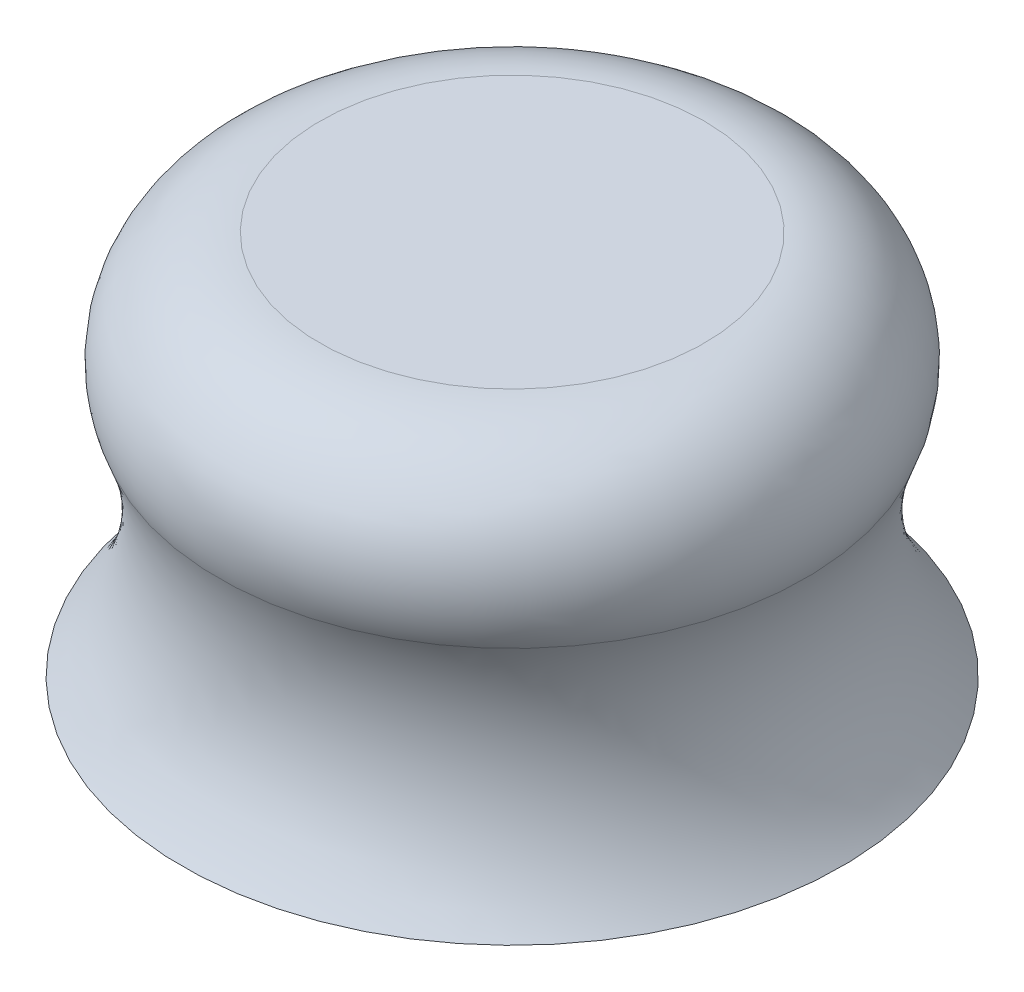
ISO-10303-21;
HEADER;
FILE_DESCRIPTION(('STEP AP214'),'2;1');
FILE_NAME('part.step','',(''),(''),'','','');
FILE_SCHEMA(('AUTOMOTIVE_DESIGN { 1 0 10303 214 1 1 1 1 }'));
ENDSEC;
DATA;
#1=APPLICATION_CONTEXT('core data for automotive mechanical design processes');
#2=APPLICATION_PROTOCOL_DEFINITION('international standard','automotive_design',2000,#1);
#3=PRODUCT_CONTEXT('',#1,'mechanical');
#4=PRODUCT('Part','Part','',(#3));
#5=PRODUCT_RELATED_PRODUCT_CATEGORY('part','',(#4));
#6=PRODUCT_DEFINITION_FORMATION('','',#4);
#7=PRODUCT_DEFINITION_CONTEXT('part definition',#1,'design');
#8=PRODUCT_DEFINITION('design','',#6,#7);
#9=PRODUCT_DEFINITION_SHAPE('','',#8);
#10=(LENGTH_UNIT() NAMED_UNIT(*) SI_UNIT(.MILLI.,.METRE.));
#11=(NAMED_UNIT(*) PLANE_ANGLE_UNIT() SI_UNIT($,.RADIAN.));
#12=(NAMED_UNIT(*) SI_UNIT($,.STERADIAN.) SOLID_ANGLE_UNIT());
#13=UNCERTAINTY_MEASURE_WITH_UNIT(LENGTH_MEASURE(1.E-05),#10,'distance_accuracy_value','');
#14=(GEOMETRIC_REPRESENTATION_CONTEXT(3) GLOBAL_UNCERTAINTY_ASSIGNED_CONTEXT((#13)) GLOBAL_UNIT_ASSIGNED_CONTEXT((#10,
#11,#12)) REPRESENTATION_CONTEXT('',''));
#15=CARTESIAN_POINT('',(0.,0.,0.));
#16=DIRECTION('',(0.,0.,1.));
#17=DIRECTION('',(1.,0.,0.));
#18=AXIS2_PLACEMENT_3D('',#15,#16,#17);
#19=CARTESIAN_POINT('',(0.,0.,0.));
#20=DIRECTION('',(0.,-1.,0.));
#21=DIRECTION('',(0.,0.,-1.));
#22=AXIS2_PLACEMENT_3D('',#19,#20,#21);
#23=PLANE('',#22);
#24=CARTESIAN_POINT('',(0.,0.,0.));
#25=DIRECTION('',(0.,-1.,0.));
#26=DIRECTION('',(0.,0.,-1.));
#27=AXIS2_PLACEMENT_3D('',#24,#25,#26);
#28=CIRCLE('',#27,30.);
#29=CARTESIAN_POINT('',(0.,0.,-30.));
#30=VERTEX_POINT('',#29);
#31=EDGE_CURVE('E10',#30,#30,#28,.T.);
#32=ORIENTED_EDGE('',*,*,#31,.T.);
#33=EDGE_LOOP('',(#32));
#34=FACE_BOUND('',#33,.T.);
#35=ADVANCED_FACE('F41',(#34),#23,.T.);
#36=CARTESIAN_POINT('',(0.,13.1566448465904,0.));
#37=DIRECTION('',(0.,-1.,0.));
#38=DIRECTION('',(0.,0.,-1.));
#39=AXIS2_PLACEMENT_3D('',#36,#37,#38);
#40=TOROIDAL_SURFACE('',#39,45.0632896931808,20.);
#41=CARTESIAN_POINT('',(0.,21.0522149488635,0.));
#42=DIRECTION('',(0.,-1.,0.));
#43=DIRECTION('',(0.,0.,-1.));
#44=AXIS2_PLACEMENT_3D('',#41,#42,#43);
#45=CIRCLE('',#44,26.6877632310603);
#46=CARTESIAN_POINT('',(0.,21.0522149488635,-26.6877632310603));
#47=VERTEX_POINT('',#46);
#48=EDGE_CURVE('E48',#47,#47,#45,.T.);
#49=ORIENTED_EDGE('',*,*,#48,.T.);
#50=EDGE_LOOP('',(#49));
#51=FACE_BOUND('',#50,.T.);
#52=ORIENTED_EDGE('',*,*,#31,.F.);
#53=EDGE_LOOP('',(#52));
#54=FACE_BOUND('',#53,.T.);
#55=ADVANCED_FACE('F70',(#51,#54),#40,.F.);
#56=CARTESIAN_POINT('',(0.,25.,0.));
#57=DIRECTION('',(0.,-1.,0.));
#58=DIRECTION('',(0.,0.,-1.));
#59=AXIS2_PLACEMENT_3D('',#56,#57,#58);
#60=TOROIDAL_SURFACE('',#59,17.5,10.);
#61=CARTESIAN_POINT('',(0.,35.,0.));
#62=DIRECTION('',(0.,-1.,0.));
#63=DIRECTION('',(0.,0.,-1.));
#64=AXIS2_PLACEMENT_3D('',#61,#62,#63);
#65=CIRCLE('',#64,17.5);
#66=CARTESIAN_POINT('',(0.,35.,-17.5));
#67=VERTEX_POINT('',#66);
#68=EDGE_CURVE('E53',#67,#67,#65,.T.);
#69=ORIENTED_EDGE('',*,*,#68,.T.);
#70=EDGE_LOOP('',(#69));
#71=FACE_BOUND('',#70,.T.);
#72=ORIENTED_EDGE('',*,*,#48,.F.);
#73=EDGE_LOOP('',(#72));
#74=FACE_BOUND('',#73,.T.);
#75=ADVANCED_FACE('F61',(#71,#74),#60,.T.);
#76=CARTESIAN_POINT('',(0.,35.,0.));
#77=DIRECTION('',(0.,1.,0.));
#78=DIRECTION('',(0.,0.,1.));
#79=AXIS2_PLACEMENT_3D('',#76,#77,#78);
#80=PLANE('',#79);
#81=ORIENTED_EDGE('',*,*,#68,.F.);
#82=EDGE_LOOP('',(#81));
#83=FACE_BOUND('',#82,.T.);
#84=ADVANCED_FACE('F64',(#83),#80,.T.);
#85=CLOSED_SHELL('',(#35,#55,#75,#84));
#86=MANIFOLD_SOLID_BREP('B2',#85);
#87=ADVANCED_BREP_SHAPE_REPRESENTATION('',(#18,#86),#14);
#88=SHAPE_DEFINITION_REPRESENTATION(#9,#87);
ENDSEC;
END-ISO-10303-21;
